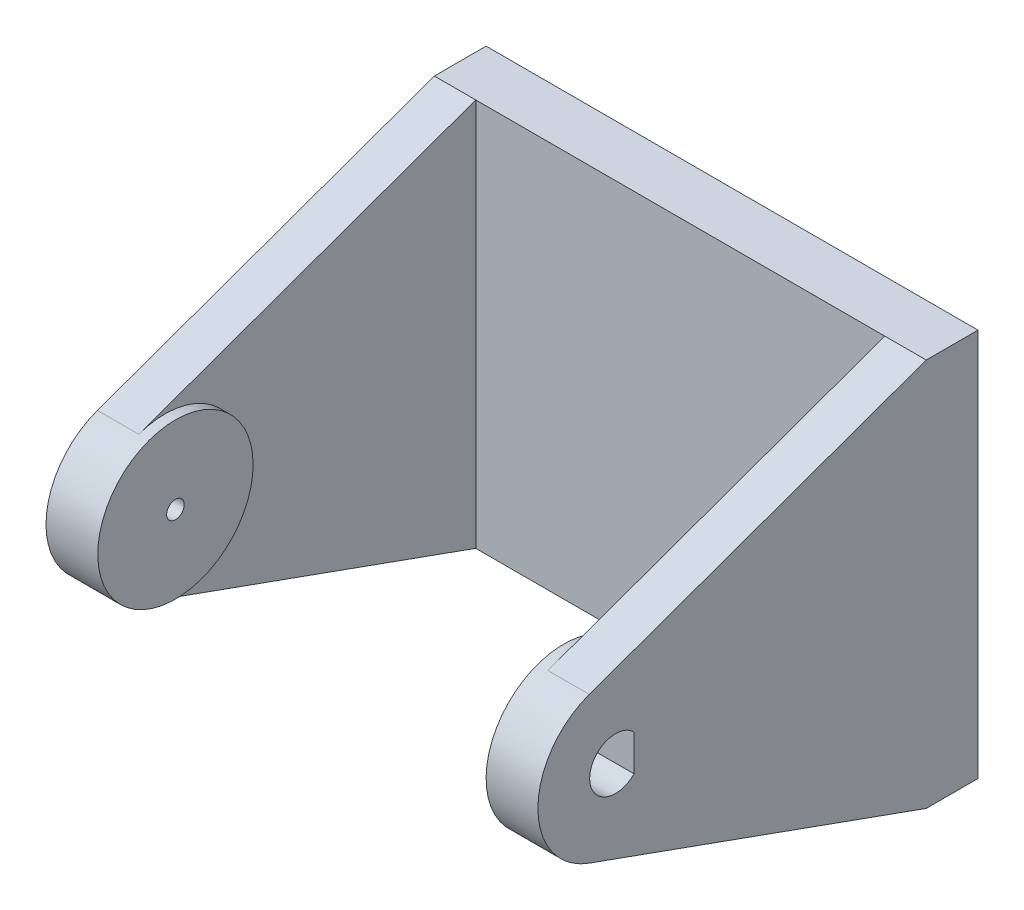
ISO-10303-21;
HEADER;
FILE_DESCRIPTION(('STEP AP214'),'2;1');
FILE_NAME('part.step','',(''),(''),'','','');
FILE_SCHEMA(('AUTOMOTIVE_DESIGN { 1 0 10303 214 1 1 1 1 }'));
ENDSEC;
DATA;
#1=APPLICATION_CONTEXT('core data for automotive mechanical design processes');
#2=APPLICATION_PROTOCOL_DEFINITION('international standard','automotive_design',2000,#1);
#3=PRODUCT_CONTEXT('',#1,'mechanical');
#4=PRODUCT('Part','Part','',(#3));
#5=PRODUCT_RELATED_PRODUCT_CATEGORY('part','',(#4));
#6=PRODUCT_DEFINITION_FORMATION('','',#4);
#7=PRODUCT_DEFINITION_CONTEXT('part definition',#1,'design');
#8=PRODUCT_DEFINITION('design','',#6,#7);
#9=PRODUCT_DEFINITION_SHAPE('','',#8);
#10=(LENGTH_UNIT() NAMED_UNIT(*) SI_UNIT(.MILLI.,.METRE.));
#11=(NAMED_UNIT(*) PLANE_ANGLE_UNIT() SI_UNIT($,.RADIAN.));
#12=(NAMED_UNIT(*) SI_UNIT($,.STERADIAN.) SOLID_ANGLE_UNIT());
#13=UNCERTAINTY_MEASURE_WITH_UNIT(LENGTH_MEASURE(1.E-05),#10,'distance_accuracy_value','');
#14=(GEOMETRIC_REPRESENTATION_CONTEXT(3) GLOBAL_UNCERTAINTY_ASSIGNED_CONTEXT((#13)) GLOBAL_UNIT_ASSIGNED_CONTEXT((#10,
#11,#12)) REPRESENTATION_CONTEXT('',''));
#15=CARTESIAN_POINT('',(0.,0.,0.));
#16=DIRECTION('',(0.,0.,1.));
#17=DIRECTION('',(1.,0.,0.));
#18=AXIS2_PLACEMENT_3D('',#15,#16,#17);
#19=CARTESIAN_POINT('',(10.,14.1162397176983,5.07264982356142));
#20=DIRECTION('',(0.,-0.941082647846552,-0.338176654904095));
#21=DIRECTION('',(0.,0.338176654904095,-0.941082647846552));
#22=AXIS2_PLACEMENT_3D('',#19,#20,#21);
#23=PLANE('',#22);
#24=DIRECTION('',(0.,-0.338176654904095,0.941082647846552));
#25=VECTOR('',#24,1.);
#26=CARTESIAN_POINT('',(8.,14.1162397176983,5.07264982356142));
#27=LINE('',#26,#25);
#28=CARTESIAN_POINT('',(8.,37.5,-60.));
#29=VERTEX_POINT('',#28);
#30=CARTESIAN_POINT('',(8.,14.1162397176983,5.07264982356142));
#31=VERTEX_POINT('',#30);
#32=EDGE_CURVE('E187',#29,#31,#27,.T.);
#33=ORIENTED_EDGE('',*,*,#32,.F.);
#34=DIRECTION('',(-1.,0.,0.));
#35=VECTOR('',#34,1.);
#36=CARTESIAN_POINT('',(10.,37.5,-60.));
#37=LINE('',#36,#35);
#38=CARTESIAN_POINT('',(0.,37.5,-60.));
#39=VERTEX_POINT('',#38);
#40=EDGE_CURVE('E270',#29,#39,#37,.T.);
#41=ORIENTED_EDGE('',*,*,#40,.T.);
#42=DIRECTION('',(0.,-0.338176654904095,0.941082647846552));
#43=VECTOR('',#42,1.);
#44=CARTESIAN_POINT('',(0.,14.1162397176983,5.07264982356142));
#45=LINE('',#44,#43);
#46=CARTESIAN_POINT('',(0.,14.1162397176983,5.07264982356142));
#47=VERTEX_POINT('',#46);
#48=EDGE_CURVE('E265',#39,#47,#45,.T.);
#49=ORIENTED_EDGE('',*,*,#48,.T.);
#50=DIRECTION('',(-1.,0.,0.));
#51=VECTOR('',#50,1.);
#52=CARTESIAN_POINT('',(10.,14.1162397176983,5.07264982356142));
#53=LINE('',#52,#51);
#54=EDGE_CURVE('E13',#31,#47,#53,.T.);
#55=ORIENTED_EDGE('',*,*,#54,.F.);
#56=EDGE_LOOP('',(#33,#41,#49,#55));
#57=FACE_BOUND('',#56,.T.);
#58=ADVANCED_FACE('F52',(#57),#23,.F.);
#59=CARTESIAN_POINT('',(10.,-14.1162397176983,5.07264982356142));
#60=DIRECTION('',(0.,-0.941082647846552,0.338176654904095));
#61=DIRECTION('',(0.,-0.338176654904095,-0.941082647846552));
#62=AXIS2_PLACEMENT_3D('',#59,#60,#61);
#63=PLANE('',#62);
#64=DIRECTION('',(-1.,0.,0.));
#65=VECTOR('',#64,1.);
#66=CARTESIAN_POINT('',(10.,-37.5,-60.));
#67=LINE('',#66,#65);
#68=CARTESIAN_POINT('',(8.,-37.5,-60.));
#69=VERTEX_POINT('',#68);
#70=CARTESIAN_POINT('',(0.,-37.5,-60.));
#71=VERTEX_POINT('',#70);
#72=EDGE_CURVE('E284',#69,#71,#67,.T.);
#73=ORIENTED_EDGE('',*,*,#72,.F.);
#74=DIRECTION('',(0.,-0.338176654904095,-0.941082647846552));
#75=VECTOR('',#74,1.);
#76=CARTESIAN_POINT('',(8.,-14.1162397176983,5.07264982356142));
#77=LINE('',#76,#75);
#78=CARTESIAN_POINT('',(8.,-14.1162397176983,5.07264982356142));
#79=VERTEX_POINT('',#78);
#80=EDGE_CURVE('E68',#79,#69,#77,.T.);
#81=ORIENTED_EDGE('',*,*,#80,.F.);
#82=DIRECTION('',(-1.,0.,0.));
#83=VECTOR('',#82,1.);
#84=CARTESIAN_POINT('',(10.,-14.1162397176983,5.07264982356142));
#85=LINE('',#84,#83);
#86=CARTESIAN_POINT('',(0.,-14.1162397176983,5.07264982356142));
#87=VERTEX_POINT('',#86);
#88=EDGE_CURVE('E61',#79,#87,#85,.T.);
#89=ORIENTED_EDGE('',*,*,#88,.T.);
#90=DIRECTION('',(0.,0.338176654904095,0.941082647846552));
#91=VECTOR('',#90,1.);
#92=CARTESIAN_POINT('',(0.,-14.1162397176983,5.07264982356142));
#93=LINE('',#92,#91);
#94=EDGE_CURVE('E271',#71,#87,#93,.T.);
#95=ORIENTED_EDGE('',*,*,#94,.F.);
#96=EDGE_LOOP('',(#73,#81,#89,#95));
#97=FACE_BOUND('',#96,.T.);
#98=ADVANCED_FACE('F315',(#97),#63,.T.);
#99=CARTESIAN_POINT('',(0.,0.,-60.));
#100=DIRECTION('',(0.,0.,-1.));
#101=DIRECTION('',(-1.,0.,0.));
#102=AXIS2_PLACEMENT_3D('',#99,#100,#101);
#103=PLANE('',#102);
#104=CARTESIAN_POINT('',(87.,-37.5,-60.));
#105=VERTEX_POINT('',#104);
#106=EDGE_CURVE('E285',#105,#69,#67,.T.);
#107=ORIENTED_EDGE('',*,*,#106,.F.);
#108=DIRECTION('',(0.,1.,0.));
#109=VECTOR('',#108,1.);
#110=CARTESIAN_POINT('',(87.,0.,-60.));
#111=LINE('',#110,#109);
#112=CARTESIAN_POINT('',(87.,37.5,-60.));
#113=VERTEX_POINT('',#112);
#114=EDGE_CURVE('E192',#105,#113,#111,.T.);
#115=ORIENTED_EDGE('',*,*,#114,.T.);
#116=EDGE_CURVE('E281',#113,#29,#37,.T.);
#117=ORIENTED_EDGE('',*,*,#116,.T.);
#118=DIRECTION('',(0.,1.,0.));
#119=VECTOR('',#118,1.);
#120=CARTESIAN_POINT('',(8.,0.,-60.));
#121=LINE('',#120,#119);
#122=EDGE_CURVE('E184',#69,#29,#121,.T.);
#123=ORIENTED_EDGE('',*,*,#122,.F.);
#124=EDGE_LOOP('',(#107,#115,#117,#123));
#125=FACE_BOUND('',#124,.T.);
#126=ADVANCED_FACE('F309',(#125),#103,.F.);
#127=CARTESIAN_POINT('',(10.,0.,0.));
#128=DIRECTION('',(-1.,0.,0.));
#129=DIRECTION('',(0.,0.,1.));
#130=AXIS2_PLACEMENT_3D('',#127,#128,#129);
#131=CYLINDRICAL_SURFACE('',#130,15.);
#132=CARTESIAN_POINT('',(8.,0.,0.));
#133=DIRECTION('',(1.,0.,0.));
#134=DIRECTION('',(0.,0.,-1.));
#135=AXIS2_PLACEMENT_3D('',#132,#133,#134);
#136=CIRCLE('',#135,15.);
#137=EDGE_CURVE('E179',#79,#31,#136,.T.);
#138=ORIENTED_EDGE('',*,*,#137,.T.);
#139=ORIENTED_EDGE('',*,*,#54,.T.);
#140=CARTESIAN_POINT('',(0.,0.,0.));
#141=DIRECTION('',(1.,0.,0.));
#142=DIRECTION('',(0.,0.,-1.));
#143=AXIS2_PLACEMENT_3D('',#140,#141,#142);
#144=CIRCLE('',#143,15.);
#145=EDGE_CURVE('E275',#47,#87,#144,.T.);
#146=ORIENTED_EDGE('',*,*,#145,.T.);
#147=ORIENTED_EDGE('',*,*,#88,.F.);
#148=EDGE_LOOP('',(#138,#139,#146,#147));
#149=FACE_BOUND('',#148,.T.);
#150=CARTESIAN_POINT('',(10.,0.,0.));
#151=DIRECTION('',(1.,0.,0.));
#152=DIRECTION('',(0.,0.,-1.));
#153=AXIS2_PLACEMENT_3D('',#150,#151,#152);
#154=CIRCLE('',#153,15.);
#155=CARTESIAN_POINT('',(10.,0.,-15.));
#156=VERTEX_POINT('',#155);
#157=EDGE_CURVE('E266',#156,#156,#154,.T.);
#158=ORIENTED_EDGE('',*,*,#157,.F.);
#159=EDGE_LOOP('',(#158));
#160=FACE_BOUND('',#159,.T.);
#161=ADVANCED_FACE('F304',(#149,#160),#131,.T.);
#162=CARTESIAN_POINT('',(10.,0.,0.));
#163=DIRECTION('',(1.,0.,0.));
#164=DIRECTION('',(0.,0.,-1.));
#165=AXIS2_PLACEMENT_3D('',#162,#163,#164);
#166=PLANE('',#165);
#167=CARTESIAN_POINT('',(10.,0.,0.));
#168=DIRECTION('',(1.,0.,0.));
#169=DIRECTION('',(0.,0.,-1.));
#170=AXIS2_PLACEMENT_3D('',#167,#168,#169);
#171=CIRCLE('',#170,1.69999999999999);
#172=CARTESIAN_POINT('',(10.,0.,-1.69999999999999));
#173=VERTEX_POINT('',#172);
#174=EDGE_CURVE('E55',#173,#173,#171,.T.);
#175=ORIENTED_EDGE('',*,*,#174,.F.);
#176=EDGE_LOOP('',(#175));
#177=FACE_BOUND('',#176,.T.);
#178=ORIENTED_EDGE('',*,*,#157,.T.);
#179=EDGE_LOOP('',(#178));
#180=FACE_BOUND('',#179,.T.);
#181=ADVANCED_FACE('F300',(#177,#180),#166,.T.);
#182=CARTESIAN_POINT('',(0.,0.,0.));
#183=DIRECTION('',(1.,0.,0.));
#184=DIRECTION('',(0.,0.,-1.));
#185=AXIS2_PLACEMENT_3D('',#182,#183,#184);
#186=PLANE('',#185);
#187=CARTESIAN_POINT('',(0.,0.,0.));
#188=DIRECTION('',(-1.,0.,0.));
#189=DIRECTION('',(0.,0.,1.));
#190=AXIS2_PLACEMENT_3D('',#187,#188,#189);
#191=CIRCLE('',#190,3.15);
#192=CARTESIAN_POINT('',(0.,0.,3.15));
#193=VERTEX_POINT('',#192);
#194=EDGE_CURVE('E171',#193,#193,#191,.T.);
#195=ORIENTED_EDGE('',*,*,#194,.F.);
#196=EDGE_LOOP('',(#195));
#197=FACE_BOUND('',#196,.T.);
#198=ORIENTED_EDGE('',*,*,#48,.F.);
#199=DIRECTION('',(0.,0.,1.));
#200=VECTOR('',#199,1.);
#201=CARTESIAN_POINT('',(0.,37.5,-70.));
#202=LINE('',#201,#200);
#203=CARTESIAN_POINT('',(0.,37.5,-70.));
#204=VERTEX_POINT('',#203);
#205=EDGE_CURVE('E261',#204,#39,#202,.T.);
#206=ORIENTED_EDGE('',*,*,#205,.F.);
#207=DIRECTION('',(0.,1.,0.));
#208=VECTOR('',#207,1.);
#209=CARTESIAN_POINT('',(0.,-37.5,-70.));
#210=LINE('',#209,#208);
#211=CARTESIAN_POINT('',(0.,-37.5,-70.));
#212=VERTEX_POINT('',#211);
#213=EDGE_CURVE('E234',#212,#204,#210,.T.);
#214=ORIENTED_EDGE('',*,*,#213,.F.);
#215=DIRECTION('',(0.,0.,1.));
#216=VECTOR('',#215,1.);
#217=CARTESIAN_POINT('',(0.,-37.5,-70.));
#218=LINE('',#217,#216);
#219=EDGE_CURVE('E247',#212,#71,#218,.T.);
#220=ORIENTED_EDGE('',*,*,#219,.T.);
#221=ORIENTED_EDGE('',*,*,#94,.T.);
#222=ORIENTED_EDGE('',*,*,#145,.F.);
#223=EDGE_LOOP('',(#198,#206,#214,#220,#221,#222));
#224=FACE_BOUND('',#223,.T.);
#225=ADVANCED_FACE('F303',(#197,#224),#186,.F.);
#226=CARTESIAN_POINT('',(0.,37.5,-70.));
#227=DIRECTION('',(0.,-1.,0.));
#228=DIRECTION('',(0.,0.,-1.));
#229=AXIS2_PLACEMENT_3D('',#226,#227,#228);
#230=PLANE('',#229);
#231=ORIENTED_EDGE('',*,*,#116,.F.);
#232=DIRECTION('',(-1.,0.,0.));
#233=VECTOR('',#232,1.);
#234=CARTESIAN_POINT('',(95.,37.5,-60.));
#235=LINE('',#234,#233);
#236=CARTESIAN_POINT('',(95.,37.5,-60.));
#237=VERTEX_POINT('',#236);
#238=EDGE_CURVE('E218',#237,#113,#235,.T.);
#239=ORIENTED_EDGE('',*,*,#238,.F.);
#240=DIRECTION('',(0.,0.,1.));
#241=VECTOR('',#240,1.);
#242=CARTESIAN_POINT('',(95.,37.5,-70.));
#243=LINE('',#242,#241);
#244=CARTESIAN_POINT('',(95.,37.5,-70.));
#245=VERTEX_POINT('',#244);
#246=EDGE_CURVE('E257',#245,#237,#243,.T.);
#247=ORIENTED_EDGE('',*,*,#246,.F.);
#248=DIRECTION('',(1.,0.,0.));
#249=VECTOR('',#248,1.);
#250=CARTESIAN_POINT('',(0.,37.5,-70.));
#251=LINE('',#250,#249);
#252=EDGE_CURVE('E238',#204,#245,#251,.T.);
#253=ORIENTED_EDGE('',*,*,#252,.F.);
#254=ORIENTED_EDGE('',*,*,#205,.T.);
#255=ORIENTED_EDGE('',*,*,#40,.F.);
#256=EDGE_LOOP('',(#231,#239,#247,#253,#254,#255));
#257=FACE_BOUND('',#256,.T.);
#258=ADVANCED_FACE('F329',(#257),#230,.F.);
#259=CARTESIAN_POINT('',(95.,-37.5,-70.));
#260=DIRECTION('',(-1.,0.,0.));
#261=DIRECTION('',(0.,-1.,0.));
#262=AXIS2_PLACEMENT_3D('',#259,#260,#261);
#263=PLANE('',#262);
#264=ORIENTED_EDGE('',*,*,#246,.T.);
#265=DIRECTION('',(0.,-0.338176654904095,0.941082647846552));
#266=VECTOR('',#265,1.);
#267=CARTESIAN_POINT('',(95.,14.1162397176983,5.07264982356142));
#268=LINE('',#267,#266);
#269=CARTESIAN_POINT('',(95.,14.1162397176983,5.07264982356142));
#270=VERTEX_POINT('',#269);
#271=EDGE_CURVE('E207',#237,#270,#268,.T.);
#272=ORIENTED_EDGE('',*,*,#271,.T.);
#273=CARTESIAN_POINT('',(95.,0.,0.));
#274=DIRECTION('',(1.,0.,0.));
#275=DIRECTION('',(0.,0.,-1.));
#276=AXIS2_PLACEMENT_3D('',#273,#274,#275);
#277=CIRCLE('',#276,15.);
#278=CARTESIAN_POINT('',(95.,-14.1162397176983,5.07264982356142));
#279=VERTEX_POINT('',#278);
#280=EDGE_CURVE('E211',#270,#279,#277,.T.);
#281=ORIENTED_EDGE('',*,*,#280,.T.);
#282=DIRECTION('',(0.,0.338176654904095,0.941082647846552));
#283=VECTOR('',#282,1.);
#284=CARTESIAN_POINT('',(95.,-14.1162397176983,5.07264982356142));
#285=LINE('',#284,#283);
#286=CARTESIAN_POINT('',(95.,-37.5,-60.));
#287=VERTEX_POINT('',#286);
#288=EDGE_CURVE('E214',#287,#279,#285,.T.);
#289=ORIENTED_EDGE('',*,*,#288,.F.);
#290=DIRECTION('',(0.,0.,1.));
#291=VECTOR('',#290,1.);
#292=CARTESIAN_POINT('',(95.,-37.5,-70.));
#293=LINE('',#292,#291);
#294=CARTESIAN_POINT('',(95.,-37.5,-70.));
#295=VERTEX_POINT('',#294);
#296=EDGE_CURVE('E254',#295,#287,#293,.T.);
#297=ORIENTED_EDGE('',*,*,#296,.F.);
#298=DIRECTION('',(0.,-1.,0.));
#299=VECTOR('',#298,1.);
#300=CARTESIAN_POINT('',(95.,-37.5,-70.));
#301=LINE('',#300,#299);
#302=EDGE_CURVE('E241',#245,#295,#301,.T.);
#303=ORIENTED_EDGE('',*,*,#302,.F.);
#304=EDGE_LOOP('',(#264,#272,#281,#289,#297,#303));
#305=FACE_BOUND('',#304,.T.);
#306=CARTESIAN_POINT('',(95.,0.,0.));
#307=DIRECTION('',(1.,0.,0.));
#308=DIRECTION('',(0.,1.,0.));
#309=AXIS2_PLACEMENT_3D('',#306,#307,#308);
#310=CIRCLE('',#309,5.);
#311=CARTESIAN_POINT('',(95.,3.49999999999998,-3.57071421427143));
#312=VERTEX_POINT('',#311);
#313=CARTESIAN_POINT('',(95.,-3.50000000000002,-3.57071421427143));
#314=VERTEX_POINT('',#313);
#315=EDGE_CURVE('E148',#312,#314,#310,.T.);
#316=ORIENTED_EDGE('',*,*,#315,.F.);
#317=DIRECTION('',(0.,1.,0.));
#318=VECTOR('',#317,1.);
#319=CARTESIAN_POINT('',(95.,-3.50000000000002,-3.57071421427143));
#320=LINE('',#319,#318);
#321=EDGE_CURVE('E157',#314,#312,#320,.T.);
#322=ORIENTED_EDGE('',*,*,#321,.F.);
#323=EDGE_LOOP('',(#316,#322));
#324=FACE_BOUND('',#323,.T.);
#325=ADVANCED_FACE('F162',(#305,#324),#263,.F.);
#326=CARTESIAN_POINT('',(0.,-37.5,-70.));
#327=DIRECTION('',(0.,1.,0.));
#328=DIRECTION('',(0.,0.,1.));
#329=AXIS2_PLACEMENT_3D('',#326,#327,#328);
#330=PLANE('',#329);
#331=DIRECTION('',(-1.,0.,0.));
#332=VECTOR('',#331,1.);
#333=CARTESIAN_POINT('',(0.,-37.5,-60.));
#334=LINE('',#333,#332);
#335=EDGE_CURVE('E233',#287,#105,#334,.T.);
#336=ORIENTED_EDGE('',*,*,#335,.T.);
#337=ORIENTED_EDGE('',*,*,#106,.T.);
#338=ORIENTED_EDGE('',*,*,#72,.T.);
#339=ORIENTED_EDGE('',*,*,#219,.F.);
#340=DIRECTION('',(-1.,0.,0.));
#341=VECTOR('',#340,1.);
#342=CARTESIAN_POINT('',(0.,-37.5,-70.));
#343=LINE('',#342,#341);
#344=EDGE_CURVE('E244',#295,#212,#343,.T.);
#345=ORIENTED_EDGE('',*,*,#344,.F.);
#346=ORIENTED_EDGE('',*,*,#296,.T.);
#347=EDGE_LOOP('',(#336,#337,#338,#339,#345,#346));
#348=FACE_BOUND('',#347,.T.);
#349=ADVANCED_FACE('F341',(#348),#330,.F.);
#350=CARTESIAN_POINT('',(0.,0.,-70.));
#351=DIRECTION('',(0.,0.,-1.));
#352=DIRECTION('',(-1.,0.,0.));
#353=AXIS2_PLACEMENT_3D('',#350,#351,#352);
#354=PLANE('',#353);
#355=ORIENTED_EDGE('',*,*,#213,.T.);
#356=ORIENTED_EDGE('',*,*,#252,.T.);
#357=ORIENTED_EDGE('',*,*,#302,.T.);
#358=ORIENTED_EDGE('',*,*,#344,.T.);
#359=EDGE_LOOP('',(#355,#356,#357,#358));
#360=FACE_BOUND('',#359,.T.);
#361=ADVANCED_FACE('F362',(#360),#354,.T.);
#362=CARTESIAN_POINT('',(95.,14.1162397176983,5.07264982356142));
#363=DIRECTION('',(0.,-0.941082647846552,-0.338176654904095));
#364=DIRECTION('',(0.,0.338176654904095,-0.941082647846552));
#365=AXIS2_PLACEMENT_3D('',#362,#363,#364);
#366=PLANE('',#365);
#367=ORIENTED_EDGE('',*,*,#238,.T.);
#368=DIRECTION('',(0.,-0.338176654904095,0.941082647846552));
#369=VECTOR('',#368,1.);
#370=CARTESIAN_POINT('',(87.,14.1162397176983,5.07264982356142));
#371=LINE('',#370,#369);
#372=CARTESIAN_POINT('',(87.,14.1162397176983,5.07264982356142));
#373=VERTEX_POINT('',#372);
#374=EDGE_CURVE('E196',#113,#373,#371,.T.);
#375=ORIENTED_EDGE('',*,*,#374,.T.);
#376=DIRECTION('',(-1.,0.,0.));
#377=VECTOR('',#376,1.);
#378=CARTESIAN_POINT('',(95.,14.1162397176983,5.07264982356142));
#379=LINE('',#378,#377);
#380=EDGE_CURVE('E229',#270,#373,#379,.T.);
#381=ORIENTED_EDGE('',*,*,#380,.F.);
#382=ORIENTED_EDGE('',*,*,#271,.F.);
#383=EDGE_LOOP('',(#367,#375,#381,#382));
#384=FACE_BOUND('',#383,.T.);
#385=ADVANCED_FACE('F355',(#384),#366,.F.);
#386=CARTESIAN_POINT('',(95.,0.,0.));
#387=DIRECTION('',(-1.,0.,0.));
#388=DIRECTION('',(0.,0.,1.));
#389=AXIS2_PLACEMENT_3D('',#386,#387,#388);
#390=CYLINDRICAL_SURFACE('',#389,15.);
#391=CARTESIAN_POINT('',(85.,0.,0.));
#392=DIRECTION('',(1.,0.,0.));
#393=DIRECTION('',(0.,0.,-1.));
#394=AXIS2_PLACEMENT_3D('',#391,#392,#393);
#395=CIRCLE('',#394,15.);
#396=CARTESIAN_POINT('',(85.,0.,-15.));
#397=VERTEX_POINT('',#396);
#398=EDGE_CURVE('E206',#397,#397,#395,.T.);
#399=ORIENTED_EDGE('',*,*,#398,.T.);
#400=EDGE_LOOP('',(#399));
#401=FACE_BOUND('',#400,.T.);
#402=ORIENTED_EDGE('',*,*,#380,.T.);
#403=CARTESIAN_POINT('',(87.,0.,0.));
#404=DIRECTION('',(1.,0.,0.));
#405=DIRECTION('',(0.,0.,-1.));
#406=AXIS2_PLACEMENT_3D('',#403,#404,#405);
#407=CIRCLE('',#406,15.);
#408=CARTESIAN_POINT('',(87.,-14.1162397176983,5.07264982356142));
#409=VERTEX_POINT('',#408);
#410=EDGE_CURVE('E191',#409,#373,#407,.T.);
#411=ORIENTED_EDGE('',*,*,#410,.F.);
#412=DIRECTION('',(-1.,0.,0.));
#413=VECTOR('',#412,1.);
#414=CARTESIAN_POINT('',(95.,-14.1162397176983,5.07264982356142));
#415=LINE('',#414,#413);
#416=EDGE_CURVE('E225',#279,#409,#415,.T.);
#417=ORIENTED_EDGE('',*,*,#416,.F.);
#418=ORIENTED_EDGE('',*,*,#280,.F.);
#419=EDGE_LOOP('',(#402,#411,#417,#418));
#420=FACE_BOUND('',#419,.T.);
#421=ADVANCED_FACE('F352',(#401,#420),#390,.T.);
#422=CARTESIAN_POINT('',(95.,-14.1162397176983,5.07264982356142));
#423=DIRECTION('',(0.,-0.941082647846552,0.338176654904095));
#424=DIRECTION('',(0.,-0.338176654904095,-0.941082647846552));
#425=AXIS2_PLACEMENT_3D('',#422,#423,#424);
#426=PLANE('',#425);
#427=DIRECTION('',(0.,-0.338176654904095,-0.941082647846552));
#428=VECTOR('',#427,1.);
#429=CARTESIAN_POINT('',(87.,-14.1162397176983,5.07264982356142));
#430=LINE('',#429,#428);
#431=EDGE_CURVE('E197',#409,#105,#430,.T.);
#432=ORIENTED_EDGE('',*,*,#431,.T.);
#433=ORIENTED_EDGE('',*,*,#335,.F.);
#434=ORIENTED_EDGE('',*,*,#288,.T.);
#435=ORIENTED_EDGE('',*,*,#416,.T.);
#436=EDGE_LOOP('',(#432,#433,#434,#435));
#437=FACE_BOUND('',#436,.T.);
#438=ADVANCED_FACE('F348',(#437),#426,.T.);
#439=CARTESIAN_POINT('',(85.,0.,0.));
#440=DIRECTION('',(1.,0.,0.));
#441=DIRECTION('',(0.,0.,-1.));
#442=AXIS2_PLACEMENT_3D('',#439,#440,#441);
#443=PLANE('',#442);
#444=ORIENTED_EDGE('',*,*,#398,.F.);
#445=EDGE_LOOP('',(#444));
#446=FACE_BOUND('',#445,.T.);
#447=DIRECTION('',(0.,-1.,0.));
#448=VECTOR('',#447,1.);
#449=CARTESIAN_POINT('',(85.,-3.50000000000001,-3.57071421427143));
#450=LINE('',#449,#448);
#451=CARTESIAN_POINT('',(85.,3.49999999999999,-3.57071421427143));
#452=VERTEX_POINT('',#451);
#453=CARTESIAN_POINT('',(85.,-3.50000000000002,-3.57071421427143));
#454=VERTEX_POINT('',#453);
#455=EDGE_CURVE('E154',#452,#454,#450,.T.);
#456=ORIENTED_EDGE('',*,*,#455,.F.);
#457=CARTESIAN_POINT('',(85.,0.,0.));
#458=DIRECTION('',(1.,0.,0.));
#459=DIRECTION('',(0.,0.,-1.));
#460=AXIS2_PLACEMENT_3D('',#457,#458,#459);
#461=CIRCLE('',#460,5.);
#462=EDGE_CURVE('E150',#454,#452,#461,.F.);
#463=ORIENTED_EDGE('',*,*,#462,.F.);
#464=EDGE_LOOP('',(#456,#463));
#465=FACE_BOUND('',#464,.T.);
#466=ADVANCED_FACE('F398',(#446,#465),#443,.F.);
#467=CARTESIAN_POINT('',(87.,0.,0.));
#468=DIRECTION('',(1.,0.,0.));
#469=DIRECTION('',(0.,0.,-1.));
#470=AXIS2_PLACEMENT_3D('',#467,#468,#469);
#471=PLANE('',#470);
#472=ORIENTED_EDGE('',*,*,#410,.T.);
#473=ORIENTED_EDGE('',*,*,#374,.F.);
#474=ORIENTED_EDGE('',*,*,#114,.F.);
#475=ORIENTED_EDGE('',*,*,#431,.F.);
#476=EDGE_LOOP('',(#472,#473,#474,#475));
#477=FACE_BOUND('',#476,.T.);
#478=ADVANCED_FACE('F345',(#477),#471,.F.);
#479=CARTESIAN_POINT('',(8.,0.,0.));
#480=DIRECTION('',(1.,0.,0.));
#481=DIRECTION('',(0.,0.,-1.));
#482=AXIS2_PLACEMENT_3D('',#479,#480,#481);
#483=PLANE('',#482);
#484=ORIENTED_EDGE('',*,*,#137,.F.);
#485=ORIENTED_EDGE('',*,*,#80,.T.);
#486=ORIENTED_EDGE('',*,*,#122,.T.);
#487=ORIENTED_EDGE('',*,*,#32,.T.);
#488=EDGE_LOOP('',(#484,#485,#486,#487));
#489=FACE_BOUND('',#488,.T.);
#490=ADVANCED_FACE('F337',(#489),#483,.T.);
#491=CARTESIAN_POINT('',(0.,0.,0.));
#492=DIRECTION('',(-1.,0.,0.));
#493=DIRECTION('',(0.,0.,1.));
#494=AXIS2_PLACEMENT_3D('',#491,#492,#493);
#495=CYLINDRICAL_SURFACE('',#494,1.69999999999999);
#496=ORIENTED_EDGE('',*,*,#174,.T.);
#497=EDGE_LOOP('',(#496));
#498=FACE_BOUND('',#497,.T.);
#499=CARTESIAN_POINT('',(1.45000000000001,0.,0.));
#500=DIRECTION('',(-1.,0.,0.));
#501=DIRECTION('',(0.,0.,1.));
#502=AXIS2_PLACEMENT_3D('',#499,#500,#501);
#503=CIRCLE('',#502,1.69999999999999);
#504=CARTESIAN_POINT('',(1.45000000000001,0.,1.69999999999999));
#505=VERTEX_POINT('',#504);
#506=EDGE_CURVE('E175',#505,#505,#503,.T.);
#507=ORIENTED_EDGE('',*,*,#506,.T.);
#508=EDGE_LOOP('',(#507));
#509=FACE_BOUND('',#508,.T.);
#510=ADVANCED_FACE('F297',(#498,#509),#495,.F.);
#511=CARTESIAN_POINT('',(0.,0.,0.));
#512=DIRECTION('',(-1.,0.,0.));
#513=DIRECTION('',(0.,0.,1.));
#514=AXIS2_PLACEMENT_3D('',#511,#512,#513);
#515=CONICAL_SURFACE('',#514,3.15,0.78539816339745);
#516=ORIENTED_EDGE('',*,*,#506,.F.);
#517=EDGE_LOOP('',(#516));
#518=FACE_BOUND('',#517,.T.);
#519=ORIENTED_EDGE('',*,*,#194,.T.);
#520=EDGE_LOOP('',(#519));
#521=FACE_BOUND('',#520,.T.);
#522=ADVANCED_FACE('F382',(#518,#521),#515,.F.);
#523=CARTESIAN_POINT('',(63.7867965644035,-3.50000000000001,-3.57071421427143));
#524=DIRECTION('',(0.,0.,-1.));
#525=DIRECTION('',(-1.,0.,0.));
#526=AXIS2_PLACEMENT_3D('',#523,#524,#525);
#527=PLANE('',#526);
#528=DIRECTION('',(1.,0.,0.));
#529=VECTOR('',#528,1.);
#530=CARTESIAN_POINT('',(63.7867965644035,3.49999999999999,-3.57071421427143));
#531=LINE('',#530,#529);
#532=EDGE_CURVE('E143',#452,#312,#531,.T.);
#533=ORIENTED_EDGE('',*,*,#532,.F.);
#534=ORIENTED_EDGE('',*,*,#455,.T.);
#535=DIRECTION('',(1.,0.,0.));
#536=VECTOR('',#535,1.);
#537=CARTESIAN_POINT('',(63.7867965644035,-3.50000000000001,-3.57071421427143));
#538=LINE('',#537,#536);
#539=EDGE_CURVE('E155',#454,#314,#538,.T.);
#540=ORIENTED_EDGE('',*,*,#539,.T.);
#541=ORIENTED_EDGE('',*,*,#321,.T.);
#542=EDGE_LOOP('',(#533,#534,#540,#541));
#543=FACE_BOUND('',#542,.T.);
#544=ADVANCED_FACE('F158',(#543),#527,.F.);
#545=CARTESIAN_POINT('',(63.7867965644035,0.,0.));
#546=DIRECTION('',(1.,0.,0.));
#547=DIRECTION('',(0.,1.,0.));
#548=AXIS2_PLACEMENT_3D('',#545,#546,#547);
#549=CYLINDRICAL_SURFACE('',#548,5.);
#550=ORIENTED_EDGE('',*,*,#539,.F.);
#551=ORIENTED_EDGE('',*,*,#462,.T.);
#552=ORIENTED_EDGE('',*,*,#532,.T.);
#553=ORIENTED_EDGE('',*,*,#315,.T.);
#554=EDGE_LOOP('',(#550,#551,#552,#553));
#555=FACE_BOUND('',#554,.T.);
#556=ADVANCED_FACE('F146',(#555),#549,.F.);
#557=CLOSED_SHELL('',(#58,#98,#126,#161,#181,#225,#258,#325,#349,#361,#385,#421,#438,#466,#478,
#490,#510,#522,#544,#556));
#558=MANIFOLD_SOLID_BREP('B2',#557);
#559=ADVANCED_BREP_SHAPE_REPRESENTATION('',(#18,#558),#14);
#560=SHAPE_DEFINITION_REPRESENTATION(#9,#559);
ENDSEC;
END-ISO-10303-21;
